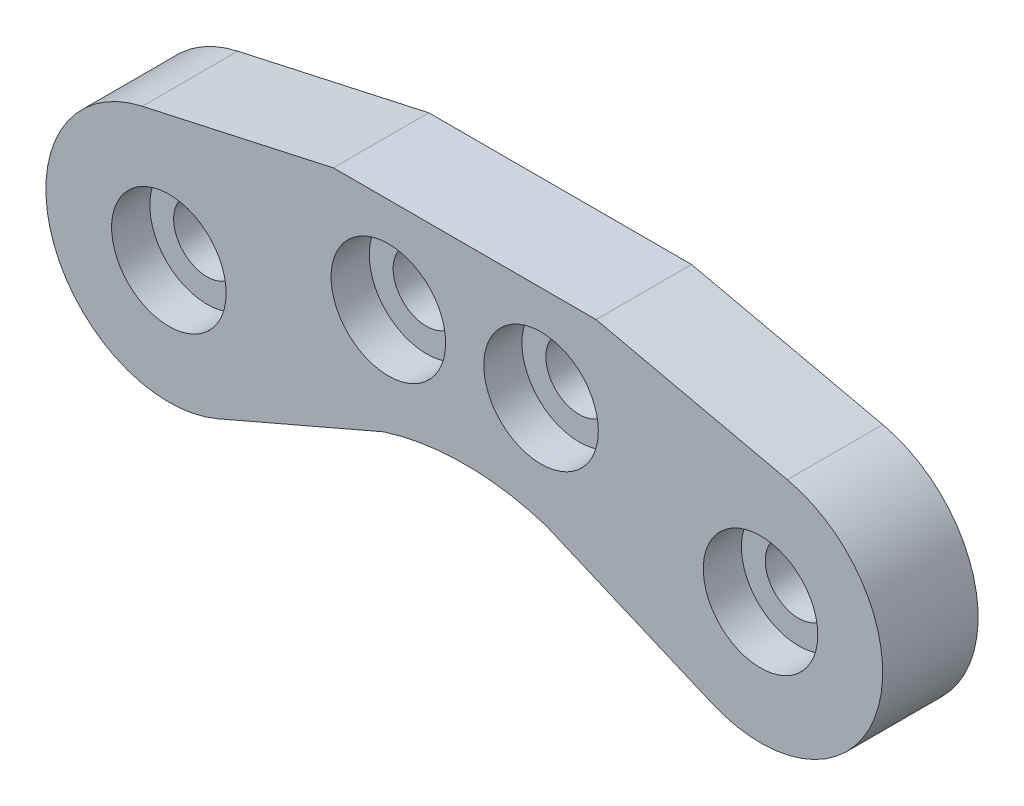
ISO-10303-21;
HEADER;
FILE_DESCRIPTION(('STEP AP214'),'2;1');
FILE_NAME('part.step','',(''),(''),'','','');
FILE_SCHEMA(('AUTOMOTIVE_DESIGN { 1 0 10303 214 1 1 1 1 }'));
ENDSEC;
DATA;
#1=APPLICATION_CONTEXT('core data for automotive mechanical design processes');
#2=APPLICATION_PROTOCOL_DEFINITION('international standard','automotive_design',2000,#1);
#3=PRODUCT_CONTEXT('',#1,'mechanical');
#4=PRODUCT('Part','Part','',(#3));
#5=PRODUCT_RELATED_PRODUCT_CATEGORY('part','',(#4));
#6=PRODUCT_DEFINITION_FORMATION('','',#4);
#7=PRODUCT_DEFINITION_CONTEXT('part definition',#1,'design');
#8=PRODUCT_DEFINITION('design','',#6,#7);
#9=PRODUCT_DEFINITION_SHAPE('','',#8);
#10=(LENGTH_UNIT() NAMED_UNIT(*) SI_UNIT(.MILLI.,.METRE.));
#11=(NAMED_UNIT(*) PLANE_ANGLE_UNIT() SI_UNIT($,.RADIAN.));
#12=(NAMED_UNIT(*) SI_UNIT($,.STERADIAN.) SOLID_ANGLE_UNIT());
#13=UNCERTAINTY_MEASURE_WITH_UNIT(LENGTH_MEASURE(1.E-05),#10,'distance_accuracy_value','');
#14=(GEOMETRIC_REPRESENTATION_CONTEXT(3) GLOBAL_UNCERTAINTY_ASSIGNED_CONTEXT((#13)) GLOBAL_UNIT_ASSIGNED_CONTEXT((#10,
#11,#12)) REPRESENTATION_CONTEXT('',''));
#15=CARTESIAN_POINT('',(0.,0.,0.));
#16=DIRECTION('',(0.,0.,1.));
#17=DIRECTION('',(1.,0.,0.));
#18=AXIS2_PLACEMENT_3D('',#15,#16,#17);
#19=CARTESIAN_POINT('',(45.5,-0.500000000000042,0.));
#20=DIRECTION('',(0.,0.,1.));
#21=DIRECTION('',(1.,0.,0.));
#22=AXIS2_PLACEMENT_3D('',#19,#20,#21);
#23=CYLINDRICAL_SURFACE('',#22,1.75);
#24=CARTESIAN_POINT('',(45.5,-0.500000000000042,0.));
#25=DIRECTION('',(0.,0.,1.));
#26=DIRECTION('',(1.,0.,0.));
#27=AXIS2_PLACEMENT_3D('',#24,#25,#26);
#28=CIRCLE('',#27,1.75);
#29=CARTESIAN_POINT('',(47.25,-0.500000000000042,0.));
#30=VERTEX_POINT('',#29);
#31=EDGE_CURVE('E179',#30,#30,#28,.T.);
#32=ORIENTED_EDGE('',*,*,#31,.F.);
#33=EDGE_LOOP('',(#32));
#34=FACE_BOUND('',#33,.T.);
#35=CARTESIAN_POINT('',(45.5,-0.500000000000042,3.));
#36=DIRECTION('',(0.,0.,1.));
#37=DIRECTION('',(1.,0.,0.));
#38=AXIS2_PLACEMENT_3D('',#35,#36,#37);
#39=CIRCLE('',#38,1.75);
#40=CARTESIAN_POINT('',(47.25,-0.500000000000042,3.));
#41=VERTEX_POINT('',#40);
#42=EDGE_CURVE('E37',#41,#41,#39,.F.);
#43=ORIENTED_EDGE('',*,*,#42,.F.);
#44=EDGE_LOOP('',(#43));
#45=FACE_BOUND('',#44,.T.);
#46=ADVANCED_FACE('F33',(#34,#45),#23,.F.);
#47=CARTESIAN_POINT('',(26.,3.00000000000002,0.));
#48=DIRECTION('',(0.,0.,1.));
#49=DIRECTION('',(1.,0.,0.));
#50=AXIS2_PLACEMENT_3D('',#47,#48,#49);
#51=CYLINDRICAL_SURFACE('',#50,1.75);
#52=CARTESIAN_POINT('',(26.,3.00000000000002,0.));
#53=DIRECTION('',(0.,0.,1.));
#54=DIRECTION('',(1.,0.,0.));
#55=AXIS2_PLACEMENT_3D('',#52,#53,#54);
#56=CIRCLE('',#55,1.75);
#57=CARTESIAN_POINT('',(27.75,3.00000000000002,0.));
#58=VERTEX_POINT('',#57);
#59=EDGE_CURVE('E174',#58,#58,#56,.T.);
#60=ORIENTED_EDGE('',*,*,#59,.F.);
#61=EDGE_LOOP('',(#60));
#62=FACE_BOUND('',#61,.T.);
#63=CARTESIAN_POINT('',(26.,3.00000000000002,3.));
#64=DIRECTION('',(0.,0.,1.));
#65=DIRECTION('',(1.,0.,0.));
#66=AXIS2_PLACEMENT_3D('',#63,#64,#65);
#67=CIRCLE('',#66,1.75);
#68=CARTESIAN_POINT('',(27.75,3.00000000000002,3.));
#69=VERTEX_POINT('',#68);
#70=EDGE_CURVE('E165',#69,#69,#67,.F.);
#71=ORIENTED_EDGE('',*,*,#70,.F.);
#72=EDGE_LOOP('',(#71));
#73=FACE_BOUND('',#72,.T.);
#74=ADVANCED_FACE('F220',(#62,#73),#51,.F.);
#75=CARTESIAN_POINT('',(34.,3.00000000000002,0.));
#76=DIRECTION('',(0.,0.,1.));
#77=DIRECTION('',(1.,0.,0.));
#78=AXIS2_PLACEMENT_3D('',#75,#76,#77);
#79=CYLINDRICAL_SURFACE('',#78,1.75);
#80=CARTESIAN_POINT('',(34.,3.00000000000002,0.));
#81=DIRECTION('',(0.,0.,1.));
#82=DIRECTION('',(1.,0.,0.));
#83=AXIS2_PLACEMENT_3D('',#80,#81,#82);
#84=CIRCLE('',#83,1.75);
#85=CARTESIAN_POINT('',(35.75,3.00000000000002,0.));
#86=VERTEX_POINT('',#85);
#87=EDGE_CURVE('E170',#86,#86,#84,.T.);
#88=ORIENTED_EDGE('',*,*,#87,.F.);
#89=EDGE_LOOP('',(#88));
#90=FACE_BOUND('',#89,.T.);
#91=CARTESIAN_POINT('',(34.,3.00000000000002,3.));
#92=DIRECTION('',(0.,0.,1.));
#93=DIRECTION('',(1.,0.,0.));
#94=AXIS2_PLACEMENT_3D('',#91,#92,#93);
#95=CIRCLE('',#94,1.75);
#96=CARTESIAN_POINT('',(35.75,3.00000000000002,3.));
#97=VERTEX_POINT('',#96);
#98=EDGE_CURVE('E162',#97,#97,#95,.F.);
#99=ORIENTED_EDGE('',*,*,#98,.F.);
#100=EDGE_LOOP('',(#99));
#101=FACE_BOUND('',#100,.T.);
#102=ADVANCED_FACE('F226',(#90,#101),#79,.F.);
#103=CARTESIAN_POINT('',(14.5,-0.49999999999998,0.));
#104=DIRECTION('',(0.,0.,1.));
#105=DIRECTION('',(1.,0.,0.));
#106=AXIS2_PLACEMENT_3D('',#103,#104,#105);
#107=CYLINDRICAL_SURFACE('',#106,1.75);
#108=CARTESIAN_POINT('',(14.5,-0.49999999999998,0.));
#109=DIRECTION('',(0.,0.,1.));
#110=DIRECTION('',(1.,0.,0.));
#111=AXIS2_PLACEMENT_3D('',#108,#109,#110);
#112=CIRCLE('',#111,1.75);
#113=CARTESIAN_POINT('',(16.25,-0.49999999999998,0.));
#114=VERTEX_POINT('',#113);
#115=EDGE_CURVE('E136',#114,#114,#112,.T.);
#116=ORIENTED_EDGE('',*,*,#115,.F.);
#117=EDGE_LOOP('',(#116));
#118=FACE_BOUND('',#117,.T.);
#119=CARTESIAN_POINT('',(14.5,-0.49999999999998,3.));
#120=DIRECTION('',(0.,0.,1.));
#121=DIRECTION('',(1.,0.,0.));
#122=AXIS2_PLACEMENT_3D('',#119,#120,#121);
#123=CIRCLE('',#122,1.75);
#124=CARTESIAN_POINT('',(16.25,-0.49999999999998,3.));
#125=VERTEX_POINT('',#124);
#126=EDGE_CURVE('E159',#125,#125,#123,.F.);
#127=ORIENTED_EDGE('',*,*,#126,.F.);
#128=EDGE_LOOP('',(#127));
#129=FACE_BOUND('',#128,.T.);
#130=ADVANCED_FACE('F249',(#118,#129),#107,.F.);
#131=CARTESIAN_POINT('',(13.1115329469218,5.79216926059621,5.));
#132=DIRECTION('',(0.215481955744482,-0.97650782216454,0.));
#133=DIRECTION('',(0.97650782216454,0.215481955744482,0.));
#134=AXIS2_PLACEMENT_3D('',#131,#132,#133);
#135=PLANE('',#134);
#136=DIRECTION('',(-0.97650782216454,-0.215481955744482,0.));
#137=VECTOR('',#136,1.);
#138=CARTESIAN_POINT('',(13.1115329469218,5.79216926059621,0.));
#139=LINE('',#138,#137);
#140=CARTESIAN_POINT('',(23.116843969807,8.,0.));
#141=VERTEX_POINT('',#140);
#142=CARTESIAN_POINT('',(13.1115329469218,5.79216926059621,0.));
#143=VERTEX_POINT('',#142);
#144=EDGE_CURVE('E132',#141,#143,#139,.T.);
#145=ORIENTED_EDGE('',*,*,#144,.T.);
#146=DIRECTION('',(0.,0.,-1.));
#147=VECTOR('',#146,1.);
#148=CARTESIAN_POINT('',(13.1115329469218,5.79216926059621,5.));
#149=LINE('',#148,#147);
#150=CARTESIAN_POINT('',(13.1115329469218,5.79216926059621,5.));
#151=VERTEX_POINT('',#150);
#152=EDGE_CURVE('E11',#151,#143,#149,.T.);
#153=ORIENTED_EDGE('',*,*,#152,.F.);
#154=DIRECTION('',(-0.97650782216454,-0.215481955744482,0.));
#155=VECTOR('',#154,1.);
#156=CARTESIAN_POINT('',(13.1115329469218,5.79216926059621,5.));
#157=LINE('',#156,#155);
#158=CARTESIAN_POINT('',(23.116843969807,8.,5.));
#159=VERTEX_POINT('',#158);
#160=EDGE_CURVE('E147',#159,#151,#157,.T.);
#161=ORIENTED_EDGE('',*,*,#160,.F.);
#162=DIRECTION('',(0.,0.,-1.));
#163=VECTOR('',#162,1.);
#164=CARTESIAN_POINT('',(23.116843969807,8.,5.));
#165=LINE('',#164,#163);
#166=EDGE_CURVE('E128',#159,#141,#165,.T.);
#167=ORIENTED_EDGE('',*,*,#166,.T.);
#168=EDGE_LOOP('',(#145,#153,#161,#167));
#169=FACE_BOUND('',#168,.T.);
#170=ADVANCED_FACE('F35',(#169),#135,.F.);
#171=CARTESIAN_POINT('',(14.5,-0.49999999999998,5.));
#172=DIRECTION('',(0.,0.,-1.));
#173=DIRECTION('',(-1.,0.,0.));
#174=AXIS2_PLACEMENT_3D('',#171,#172,#173);
#175=CYLINDRICAL_SURFACE('',#174,6.44354209743951);
#176=CARTESIAN_POINT('',(14.5,-0.49999999999998,0.));
#177=DIRECTION('',(0.,0.,1.));
#178=DIRECTION('',(1.,0.,0.));
#179=AXIS2_PLACEMENT_3D('',#176,#177,#178);
#180=CIRCLE('',#179,6.44354209743951);
#181=CARTESIAN_POINT('',(17.054090449502,-6.41572960312063,0.));
#182=VERTEX_POINT('',#181);
#183=EDGE_CURVE('E135',#143,#182,#180,.T.);
#184=ORIENTED_EDGE('',*,*,#183,.T.);
#185=DIRECTION('',(0.,0.,-1.));
#186=VECTOR('',#185,1.);
#187=CARTESIAN_POINT('',(17.054090449502,-6.41572960312063,5.));
#188=LINE('',#187,#186);
#189=CARTESIAN_POINT('',(17.054090449502,-6.41572960312063,5.));
#190=VERTEX_POINT('',#189);
#191=EDGE_CURVE('E43',#190,#182,#188,.T.);
#192=ORIENTED_EDGE('',*,*,#191,.F.);
#193=CARTESIAN_POINT('',(14.5,-0.49999999999998,5.));
#194=DIRECTION('',(0.,0.,1.));
#195=DIRECTION('',(1.,0.,0.));
#196=AXIS2_PLACEMENT_3D('',#193,#194,#195);
#197=CIRCLE('',#196,6.44354209743951);
#198=EDGE_CURVE('E95',#151,#190,#197,.T.);
#199=ORIENTED_EDGE('',*,*,#198,.F.);
#200=ORIENTED_EDGE('',*,*,#152,.T.);
#201=EDGE_LOOP('',(#184,#192,#199,#200));
#202=FACE_BOUND('',#201,.T.);
#203=ADVANCED_FACE('F258',(#202),#175,.T.);
#204=CARTESIAN_POINT('',(25.7555585383118,-2.65890871486508,5.));
#205=DIRECTION('',(-0.396379880953503,0.918086591763155,0.));
#206=DIRECTION('',(-0.918086591763155,-0.396379880953503,0.));
#207=AXIS2_PLACEMENT_3D('',#204,#205,#206);
#208=PLANE('',#207);
#209=DIRECTION('',(0.918086591763155,0.396379880953503,0.));
#210=VECTOR('',#209,1.);
#211=CARTESIAN_POINT('',(25.7555585383118,-2.65890871486508,0.));
#212=LINE('',#211,#210);
#213=CARTESIAN_POINT('',(25.7555585383118,-2.65890871486508,0.));
#214=VERTEX_POINT('',#213);
#215=EDGE_CURVE('E138',#182,#214,#212,.T.);
#216=ORIENTED_EDGE('',*,*,#215,.T.);
#217=DIRECTION('',(0.,0.,-1.));
#218=VECTOR('',#217,1.);
#219=CARTESIAN_POINT('',(25.7555585383118,-2.65890871486508,5.));
#220=LINE('',#219,#218);
#221=CARTESIAN_POINT('',(25.7555585383118,-2.65890871486508,5.));
#222=VERTEX_POINT('',#221);
#223=EDGE_CURVE('E154',#222,#214,#220,.T.);
#224=ORIENTED_EDGE('',*,*,#223,.F.);
#225=DIRECTION('',(0.918086591763155,0.396379880953503,0.));
#226=VECTOR('',#225,1.);
#227=CARTESIAN_POINT('',(25.7555585383118,-2.65890871486508,5.));
#228=LINE('',#227,#226);
#229=EDGE_CURVE('E188',#190,#222,#228,.T.);
#230=ORIENTED_EDGE('',*,*,#229,.F.);
#231=ORIENTED_EDGE('',*,*,#191,.T.);
#232=EDGE_LOOP('',(#216,#224,#230,#231));
#233=FACE_BOUND('',#232,.T.);
#234=ADVANCED_FACE('F430',(#233),#208,.F.);
#235=CARTESIAN_POINT('',(30.,-15.9999999999997,5.));
#236=DIRECTION('',(0.,0.,-1.));
#237=DIRECTION('',(-1.,0.,0.));
#238=AXIS2_PLACEMENT_3D('',#235,#236,#237);
#239=CYLINDRICAL_SURFACE('',#238,13.9999999999998);
#240=CARTESIAN_POINT('',(30.,-15.9999999999997,0.));
#241=DIRECTION('',(0.,0.,-1.));
#242=DIRECTION('',(1.,0.,0.));
#243=AXIS2_PLACEMENT_3D('',#240,#241,#242);
#244=CIRCLE('',#243,13.9999999999998);
#245=CARTESIAN_POINT('',(34.2444414616882,-2.65890871486509,0.));
#246=VERTEX_POINT('',#245);
#247=EDGE_CURVE('E140',#214,#246,#244,.T.);
#248=ORIENTED_EDGE('',*,*,#247,.T.);
#249=DIRECTION('',(0.,0.,-1.));
#250=VECTOR('',#249,1.);
#251=CARTESIAN_POINT('',(34.2444414616882,-2.65890871486509,5.));
#252=LINE('',#251,#250);
#253=CARTESIAN_POINT('',(34.2444414616882,-2.65890871486509,5.));
#254=VERTEX_POINT('',#253);
#255=EDGE_CURVE('E151',#254,#246,#252,.T.);
#256=ORIENTED_EDGE('',*,*,#255,.F.);
#257=CARTESIAN_POINT('',(30.,-15.9999999999997,5.));
#258=DIRECTION('',(0.,0.,-1.));
#259=DIRECTION('',(1.,0.,0.));
#260=AXIS2_PLACEMENT_3D('',#257,#258,#259);
#261=CIRCLE('',#260,13.9999999999998);
#262=EDGE_CURVE('E190',#222,#254,#261,.T.);
#263=ORIENTED_EDGE('',*,*,#262,.F.);
#264=ORIENTED_EDGE('',*,*,#223,.T.);
#265=EDGE_LOOP('',(#248,#256,#263,#264));
#266=FACE_BOUND('',#265,.T.);
#267=ADVANCED_FACE('F196',(#266),#239,.F.);
#268=CARTESIAN_POINT('',(34.2444414616882,-2.65890871486509,5.));
#269=DIRECTION('',(0.392260789113719,0.91985405001222,0.));
#270=DIRECTION('',(-0.91985405001222,0.392260789113719,0.));
#271=AXIS2_PLACEMENT_3D('',#268,#269,#270);
#272=PLANE('',#271);
#273=DIRECTION('',(0.91985405001222,-0.392260789113719,0.));
#274=VECTOR('',#273,1.);
#275=CARTESIAN_POINT('',(34.2444414616882,-2.65890871486509,0.));
#276=LINE('',#275,#274);
#277=CARTESIAN_POINT('',(42.9891405720765,-6.38798135802775,0.));
#278=VERTEX_POINT('',#277);
#279=EDGE_CURVE('E142',#246,#278,#276,.T.);
#280=ORIENTED_EDGE('',*,*,#279,.T.);
#281=DIRECTION('',(0.,0.,-1.));
#282=VECTOR('',#281,1.);
#283=CARTESIAN_POINT('',(42.9891405720765,-6.38798135802775,5.));
#284=LINE('',#283,#282);
#285=CARTESIAN_POINT('',(42.9891405720765,-6.38798135802775,5.));
#286=VERTEX_POINT('',#285);
#287=EDGE_CURVE('E123',#286,#278,#284,.T.);
#288=ORIENTED_EDGE('',*,*,#287,.F.);
#289=DIRECTION('',(0.91985405001222,-0.392260789113719,0.));
#290=VECTOR('',#289,1.);
#291=CARTESIAN_POINT('',(34.2444414616882,-2.65890871486509,5.));
#292=LINE('',#291,#290);
#293=EDGE_CURVE('E114',#254,#286,#292,.T.);
#294=ORIENTED_EDGE('',*,*,#293,.F.);
#295=ORIENTED_EDGE('',*,*,#255,.T.);
#296=EDGE_LOOP('',(#280,#288,#294,#295));
#297=FACE_BOUND('',#296,.T.);
#298=ADVANCED_FACE('F200',(#297),#272,.F.);
#299=CARTESIAN_POINT('',(45.5,-0.500000000000042,5.));
#300=DIRECTION('',(0.,0.,-1.));
#301=DIRECTION('',(-1.,0.,0.));
#302=AXIS2_PLACEMENT_3D('',#299,#300,#301);
#303=CYLINDRICAL_SURFACE('',#302,6.40099519912913);
#304=CARTESIAN_POINT('',(45.5,-0.500000000000042,0.));
#305=DIRECTION('',(0.,0.,1.));
#306=DIRECTION('',(1.,0.,0.));
#307=AXIS2_PLACEMENT_3D('',#304,#305,#306);
#308=CIRCLE('',#307,6.40099519912913);
#309=CARTESIAN_POINT('',(46.9052092102304,5.744848005737,0.));
#310=VERTEX_POINT('',#309);
#311=EDGE_CURVE('E122',#278,#310,#308,.T.);
#312=ORIENTED_EDGE('',*,*,#311,.T.);
#313=DIRECTION('',(0.,0.,-1.));
#314=VECTOR('',#313,1.);
#315=CARTESIAN_POINT('',(46.9052092102304,5.744848005737,5.));
#316=LINE('',#315,#314);
#317=CARTESIAN_POINT('',(46.9052092102304,5.744848005737,5.));
#318=VERTEX_POINT('',#317);
#319=EDGE_CURVE('E119',#318,#310,#316,.T.);
#320=ORIENTED_EDGE('',*,*,#319,.F.);
#321=CARTESIAN_POINT('',(45.5,-0.500000000000042,5.));
#322=DIRECTION('',(0.,0.,1.));
#323=DIRECTION('',(1.,0.,0.));
#324=AXIS2_PLACEMENT_3D('',#321,#322,#323);
#325=CIRCLE('',#324,6.40099519912913);
#326=EDGE_CURVE('E108',#286,#318,#325,.T.);
#327=ORIENTED_EDGE('',*,*,#326,.F.);
#328=ORIENTED_EDGE('',*,*,#287,.T.);
#329=EDGE_LOOP('',(#312,#320,#327,#328));
#330=FACE_BOUND('',#329,.T.);
#331=ADVANCED_FACE('F120',(#330),#303,.T.);
#332=CARTESIAN_POINT('',(46.9052092102304,5.744848005737,5.));
#333=DIRECTION('',(-0.21952980224412,-0.975605794328149,0.));
#334=DIRECTION('',(0.975605794328149,-0.21952980224412,0.));
#335=AXIS2_PLACEMENT_3D('',#332,#333,#334);
#336=PLANE('',#335);
#337=DIRECTION('',(-0.975605794328148,0.21952980224412,0.));
#338=VECTOR('',#337,1.);
#339=CARTESIAN_POINT('',(46.9052092102304,5.744848005737,0.));
#340=LINE('',#339,#338);
#341=CARTESIAN_POINT('',(36.883156030193,8.,0.));
#342=VERTEX_POINT('',#341);
#343=EDGE_CURVE('E81',#310,#342,#340,.T.);
#344=ORIENTED_EDGE('',*,*,#343,.T.);
#345=DIRECTION('',(0.,0.,-1.));
#346=VECTOR('',#345,1.);
#347=CARTESIAN_POINT('',(36.883156030193,8.,5.));
#348=LINE('',#347,#346);
#349=CARTESIAN_POINT('',(36.883156030193,8.,5.));
#350=VERTEX_POINT('',#349);
#351=EDGE_CURVE('E124',#350,#342,#348,.T.);
#352=ORIENTED_EDGE('',*,*,#351,.F.);
#353=DIRECTION('',(-0.975605794328148,0.21952980224412,0.));
#354=VECTOR('',#353,1.);
#355=CARTESIAN_POINT('',(46.9052092102304,5.744848005737,5.));
#356=LINE('',#355,#354);
#357=EDGE_CURVE('E112',#318,#350,#356,.T.);
#358=ORIENTED_EDGE('',*,*,#357,.F.);
#359=ORIENTED_EDGE('',*,*,#319,.T.);
#360=EDGE_LOOP('',(#344,#352,#358,#359));
#361=FACE_BOUND('',#360,.T.);
#362=ADVANCED_FACE('F126',(#361),#336,.F.);
#363=CARTESIAN_POINT('',(23.116843969807,8.,5.));
#364=DIRECTION('',(0.,-1.,0.));
#365=DIRECTION('',(1.,0.,0.));
#366=AXIS2_PLACEMENT_3D('',#363,#364,#365);
#367=PLANE('',#366);
#368=DIRECTION('',(-1.,0.,0.));
#369=VECTOR('',#368,1.);
#370=CARTESIAN_POINT('',(23.116843969807,8.,0.));
#371=LINE('',#370,#369);
#372=EDGE_CURVE('E87',#342,#141,#371,.T.);
#373=ORIENTED_EDGE('',*,*,#372,.T.);
#374=ORIENTED_EDGE('',*,*,#166,.F.);
#375=DIRECTION('',(-1.,0.,0.));
#376=VECTOR('',#375,1.);
#377=CARTESIAN_POINT('',(23.116843969807,8.,5.));
#378=LINE('',#377,#376);
#379=EDGE_CURVE('E52',#350,#159,#378,.T.);
#380=ORIENTED_EDGE('',*,*,#379,.F.);
#381=ORIENTED_EDGE('',*,*,#351,.T.);
#382=EDGE_LOOP('',(#373,#374,#380,#381));
#383=FACE_BOUND('',#382,.T.);
#384=ADVANCED_FACE('F208',(#383),#367,.F.);
#385=CARTESIAN_POINT('',(45.5,-0.500000000000042,5.));
#386=DIRECTION('',(0.,0.,1.));
#387=DIRECTION('',(1.,0.,0.));
#388=AXIS2_PLACEMENT_3D('',#385,#386,#387);
#389=PLANE('',#388);
#390=CARTESIAN_POINT('',(14.5,-0.49999999999998,5.));
#391=DIRECTION('',(0.,0.,1.));
#392=DIRECTION('',(1.,0.,0.));
#393=AXIS2_PLACEMENT_3D('',#390,#391,#392);
#394=CIRCLE('',#393,3.);
#395=CARTESIAN_POINT('',(17.5,-0.49999999999998,5.));
#396=VERTEX_POINT('',#395);
#397=EDGE_CURVE('E311',#396,#396,#394,.T.);
#398=ORIENTED_EDGE('',*,*,#397,.F.);
#399=EDGE_LOOP('',(#398));
#400=FACE_BOUND('',#399,.T.);
#401=CARTESIAN_POINT('',(45.5,-0.500000000000042,5.));
#402=DIRECTION('',(0.,0.,1.));
#403=DIRECTION('',(1.,0.,0.));
#404=AXIS2_PLACEMENT_3D('',#401,#402,#403);
#405=CIRCLE('',#404,3.);
#406=CARTESIAN_POINT('',(48.5,-0.500000000000042,5.));
#407=VERTEX_POINT('',#406);
#408=EDGE_CURVE('E305',#407,#407,#405,.T.);
#409=ORIENTED_EDGE('',*,*,#408,.F.);
#410=EDGE_LOOP('',(#409));
#411=FACE_BOUND('',#410,.T.);
#412=CARTESIAN_POINT('',(34.,3.00000000000002,5.));
#413=DIRECTION('',(0.,0.,1.));
#414=DIRECTION('',(1.,0.,0.));
#415=AXIS2_PLACEMENT_3D('',#412,#413,#414);
#416=CIRCLE('',#415,3.);
#417=CARTESIAN_POINT('',(37.,3.00000000000002,5.));
#418=VERTEX_POINT('',#417);
#419=EDGE_CURVE('E296',#418,#418,#416,.T.);
#420=ORIENTED_EDGE('',*,*,#419,.F.);
#421=EDGE_LOOP('',(#420));
#422=FACE_BOUND('',#421,.T.);
#423=CARTESIAN_POINT('',(26.,3.00000000000002,5.));
#424=DIRECTION('',(0.,0.,1.));
#425=DIRECTION('',(1.,0.,0.));
#426=AXIS2_PLACEMENT_3D('',#423,#424,#425);
#427=CIRCLE('',#426,3.);
#428=CARTESIAN_POINT('',(29.,3.00000000000002,5.));
#429=VERTEX_POINT('',#428);
#430=EDGE_CURVE('E295',#429,#429,#427,.T.);
#431=ORIENTED_EDGE('',*,*,#430,.F.);
#432=EDGE_LOOP('',(#431));
#433=FACE_BOUND('',#432,.T.);
#434=ORIENTED_EDGE('',*,*,#160,.T.);
#435=ORIENTED_EDGE('',*,*,#198,.T.);
#436=ORIENTED_EDGE('',*,*,#229,.T.);
#437=ORIENTED_EDGE('',*,*,#262,.T.);
#438=ORIENTED_EDGE('',*,*,#293,.T.);
#439=ORIENTED_EDGE('',*,*,#326,.T.);
#440=ORIENTED_EDGE('',*,*,#357,.T.);
#441=ORIENTED_EDGE('',*,*,#379,.T.);
#442=EDGE_LOOP('',(#434,#435,#436,#437,#438,#439,#440,#441));
#443=FACE_BOUND('',#442,.T.);
#444=ADVANCED_FACE('F110',(#400,#411,#422,#433,#443),#389,.T.);
#445=CARTESIAN_POINT('',(45.5,-0.500000000000042,0.));
#446=DIRECTION('',(0.,0.,1.));
#447=DIRECTION('',(1.,0.,0.));
#448=AXIS2_PLACEMENT_3D('',#445,#446,#447);
#449=PLANE('',#448);
#450=ORIENTED_EDGE('',*,*,#115,.T.);
#451=EDGE_LOOP('',(#450));
#452=FACE_BOUND('',#451,.T.);
#453=ORIENTED_EDGE('',*,*,#87,.T.);
#454=EDGE_LOOP('',(#453));
#455=FACE_BOUND('',#454,.T.);
#456=ORIENTED_EDGE('',*,*,#59,.T.);
#457=EDGE_LOOP('',(#456));
#458=FACE_BOUND('',#457,.T.);
#459=ORIENTED_EDGE('',*,*,#31,.T.);
#460=EDGE_LOOP('',(#459));
#461=FACE_BOUND('',#460,.T.);
#462=ORIENTED_EDGE('',*,*,#144,.F.);
#463=ORIENTED_EDGE('',*,*,#372,.F.);
#464=ORIENTED_EDGE('',*,*,#343,.F.);
#465=ORIENTED_EDGE('',*,*,#311,.F.);
#466=ORIENTED_EDGE('',*,*,#279,.F.);
#467=ORIENTED_EDGE('',*,*,#247,.F.);
#468=ORIENTED_EDGE('',*,*,#215,.F.);
#469=ORIENTED_EDGE('',*,*,#183,.F.);
#470=EDGE_LOOP('',(#462,#463,#464,#465,#466,#467,#468,#469));
#471=FACE_BOUND('',#470,.T.);
#472=ADVANCED_FACE('F203',(#452,#455,#458,#461,#471),#449,.F.);
#473=CARTESIAN_POINT('',(14.5,-0.49999999999998,3.));
#474=DIRECTION('',(0.,0.,1.));
#475=DIRECTION('',(1.,0.,0.));
#476=AXIS2_PLACEMENT_3D('',#473,#474,#475);
#477=PLANE('',#476);
#478=CARTESIAN_POINT('',(14.5,-0.49999999999998,3.));
#479=DIRECTION('',(0.,0.,1.));
#480=DIRECTION('',(1.,0.,0.));
#481=AXIS2_PLACEMENT_3D('',#478,#479,#480);
#482=CIRCLE('',#481,3.);
#483=CARTESIAN_POINT('',(17.5,-0.49999999999998,3.));
#484=VERTEX_POINT('',#483);
#485=EDGE_CURVE('E308',#484,#484,#482,.T.);
#486=ORIENTED_EDGE('',*,*,#485,.T.);
#487=EDGE_LOOP('',(#486));
#488=FACE_BOUND('',#487,.T.);
#489=ORIENTED_EDGE('',*,*,#126,.T.);
#490=EDGE_LOOP('',(#489));
#491=FACE_BOUND('',#490,.T.);
#492=ADVANCED_FACE('F234',(#488,#491),#477,.T.);
#493=CARTESIAN_POINT('',(14.5,-0.49999999999998,3.));
#494=DIRECTION('',(0.,0.,1.));
#495=DIRECTION('',(1.,0.,0.));
#496=AXIS2_PLACEMENT_3D('',#493,#494,#495);
#497=CYLINDRICAL_SURFACE('',#496,3.);
#498=ORIENTED_EDGE('',*,*,#485,.F.);
#499=EDGE_LOOP('',(#498));
#500=FACE_BOUND('',#499,.T.);
#501=ORIENTED_EDGE('',*,*,#397,.T.);
#502=EDGE_LOOP('',(#501));
#503=FACE_BOUND('',#502,.T.);
#504=ADVANCED_FACE('F239',(#500,#503),#497,.F.);
#505=CARTESIAN_POINT('',(34.,3.00000000000002,3.));
#506=DIRECTION('',(0.,0.,1.));
#507=DIRECTION('',(1.,0.,0.));
#508=AXIS2_PLACEMENT_3D('',#505,#506,#507);
#509=PLANE('',#508);
#510=CARTESIAN_POINT('',(34.,3.00000000000002,3.));
#511=DIRECTION('',(0.,0.,1.));
#512=DIRECTION('',(1.,0.,0.));
#513=AXIS2_PLACEMENT_3D('',#510,#511,#512);
#514=CIRCLE('',#513,3.);
#515=CARTESIAN_POINT('',(37.,3.00000000000002,3.));
#516=VERTEX_POINT('',#515);
#517=EDGE_CURVE('E292',#516,#516,#514,.T.);
#518=ORIENTED_EDGE('',*,*,#517,.T.);
#519=EDGE_LOOP('',(#518));
#520=FACE_BOUND('',#519,.T.);
#521=ORIENTED_EDGE('',*,*,#98,.T.);
#522=EDGE_LOOP('',(#521));
#523=FACE_BOUND('',#522,.T.);
#524=ADVANCED_FACE('F272',(#520,#523),#509,.T.);
#525=CARTESIAN_POINT('',(34.,3.00000000000002,3.));
#526=DIRECTION('',(0.,0.,1.));
#527=DIRECTION('',(1.,0.,0.));
#528=AXIS2_PLACEMENT_3D('',#525,#526,#527);
#529=CYLINDRICAL_SURFACE('',#528,3.);
#530=ORIENTED_EDGE('',*,*,#517,.F.);
#531=EDGE_LOOP('',(#530));
#532=FACE_BOUND('',#531,.T.);
#533=ORIENTED_EDGE('',*,*,#419,.T.);
#534=EDGE_LOOP('',(#533));
#535=FACE_BOUND('',#534,.T.);
#536=ADVANCED_FACE('F269',(#532,#535),#529,.F.);
#537=CARTESIAN_POINT('',(26.,3.00000000000002,3.));
#538=DIRECTION('',(0.,0.,1.));
#539=DIRECTION('',(1.,0.,0.));
#540=AXIS2_PLACEMENT_3D('',#537,#538,#539);
#541=PLANE('',#540);
#542=CARTESIAN_POINT('',(26.,3.00000000000002,3.));
#543=DIRECTION('',(0.,0.,1.));
#544=DIRECTION('',(1.,0.,0.));
#545=AXIS2_PLACEMENT_3D('',#542,#543,#544);
#546=CIRCLE('',#545,3.);
#547=CARTESIAN_POINT('',(29.,3.00000000000002,3.));
#548=VERTEX_POINT('',#547);
#549=EDGE_CURVE('E163',#548,#548,#546,.T.);
#550=ORIENTED_EDGE('',*,*,#549,.T.);
#551=EDGE_LOOP('',(#550));
#552=FACE_BOUND('',#551,.T.);
#553=ORIENTED_EDGE('',*,*,#70,.T.);
#554=EDGE_LOOP('',(#553));
#555=FACE_BOUND('',#554,.T.);
#556=ADVANCED_FACE('F265',(#552,#555),#541,.T.);
#557=CARTESIAN_POINT('',(26.,3.00000000000002,3.));
#558=DIRECTION('',(0.,0.,1.));
#559=DIRECTION('',(1.,0.,0.));
#560=AXIS2_PLACEMENT_3D('',#557,#558,#559);
#561=CYLINDRICAL_SURFACE('',#560,3.);
#562=ORIENTED_EDGE('',*,*,#549,.F.);
#563=EDGE_LOOP('',(#562));
#564=FACE_BOUND('',#563,.T.);
#565=ORIENTED_EDGE('',*,*,#430,.T.);
#566=EDGE_LOOP('',(#565));
#567=FACE_BOUND('',#566,.T.);
#568=ADVANCED_FACE('F261',(#564,#567),#561,.F.);
#569=CARTESIAN_POINT('',(45.5,-0.500000000000042,3.));
#570=DIRECTION('',(0.,0.,1.));
#571=DIRECTION('',(1.,0.,0.));
#572=AXIS2_PLACEMENT_3D('',#569,#570,#571);
#573=PLANE('',#572);
#574=CARTESIAN_POINT('',(45.5,-0.500000000000042,3.));
#575=DIRECTION('',(0.,0.,1.));
#576=DIRECTION('',(1.,0.,0.));
#577=AXIS2_PLACEMENT_3D('',#574,#575,#576);
#578=CIRCLE('',#577,3.);
#579=CARTESIAN_POINT('',(48.5,-0.500000000000042,3.));
#580=VERTEX_POINT('',#579);
#581=EDGE_CURVE('E300',#580,#580,#578,.T.);
#582=ORIENTED_EDGE('',*,*,#581,.T.);
#583=EDGE_LOOP('',(#582));
#584=FACE_BOUND('',#583,.T.);
#585=ORIENTED_EDGE('',*,*,#42,.T.);
#586=EDGE_LOOP('',(#585));
#587=FACE_BOUND('',#586,.T.);
#588=ADVANCED_FACE('F264',(#584,#587),#573,.T.);
#589=CARTESIAN_POINT('',(45.5,-0.500000000000042,3.));
#590=DIRECTION('',(0.,0.,1.));
#591=DIRECTION('',(1.,0.,0.));
#592=AXIS2_PLACEMENT_3D('',#589,#590,#591);
#593=CYLINDRICAL_SURFACE('',#592,3.);
#594=ORIENTED_EDGE('',*,*,#581,.F.);
#595=EDGE_LOOP('',(#594));
#596=FACE_BOUND('',#595,.T.);
#597=ORIENTED_EDGE('',*,*,#408,.T.);
#598=EDGE_LOOP('',(#597));
#599=FACE_BOUND('',#598,.T.);
#600=ADVANCED_FACE('F275',(#596,#599),#593,.F.);
#601=CLOSED_SHELL('',(#46,#74,#102,#130,#170,#203,#234,#267,#298,#331,#362,#384,#444,#472,#492,
#504,#524,#536,#556,#568,#588,#600));
#602=MANIFOLD_SOLID_BREP('B2',#601);
#603=ADVANCED_BREP_SHAPE_REPRESENTATION('',(#18,#602),#14);
#604=SHAPE_DEFINITION_REPRESENTATION(#9,#603);
ENDSEC;
END-ISO-10303-21;
